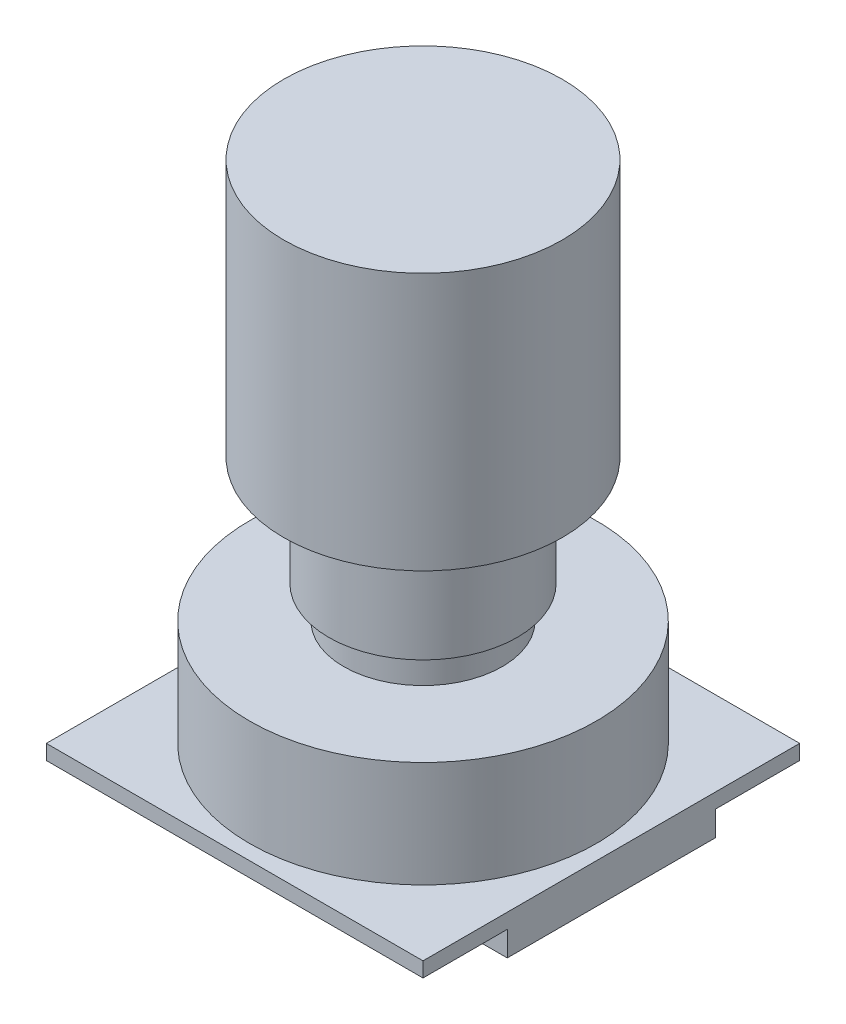
ISO-10303-21;
HEADER;
FILE_DESCRIPTION(('STEP AP214'),'2;1');
FILE_NAME('part.step','',(''),(''),'','','');
FILE_SCHEMA(('AUTOMOTIVE_DESIGN { 1 0 10303 214 1 1 1 1 }'));
ENDSEC;
DATA;
#1=APPLICATION_CONTEXT('core data for automotive mechanical design processes');
#2=APPLICATION_PROTOCOL_DEFINITION('international standard','automotive_design',2000,#1);
#3=PRODUCT_CONTEXT('',#1,'mechanical');
#4=PRODUCT('Part','Part','',(#3));
#5=PRODUCT_RELATED_PRODUCT_CATEGORY('part','',(#4));
#6=PRODUCT_DEFINITION_FORMATION('','',#4);
#7=PRODUCT_DEFINITION_CONTEXT('part definition',#1,'design');
#8=PRODUCT_DEFINITION('design','',#6,#7);
#9=PRODUCT_DEFINITION_SHAPE('','',#8);
#10=(LENGTH_UNIT() NAMED_UNIT(*) SI_UNIT(.MILLI.,.METRE.));
#11=(NAMED_UNIT(*) PLANE_ANGLE_UNIT() SI_UNIT($,.RADIAN.));
#12=(NAMED_UNIT(*) SI_UNIT($,.STERADIAN.) SOLID_ANGLE_UNIT());
#13=UNCERTAINTY_MEASURE_WITH_UNIT(LENGTH_MEASURE(1.E-05),#10,'distance_accuracy_value','');
#14=(GEOMETRIC_REPRESENTATION_CONTEXT(3) GLOBAL_UNCERTAINTY_ASSIGNED_CONTEXT((#13)) GLOBAL_UNIT_ASSIGNED_CONTEXT((#10,
#11,#12)) REPRESENTATION_CONTEXT('',''));
#15=CARTESIAN_POINT('',(0.,0.,0.));
#16=DIRECTION('',(0.,0.,1.));
#17=DIRECTION('',(1.,0.,0.));
#18=AXIS2_PLACEMENT_3D('',#15,#16,#17);
#19=CARTESIAN_POINT('',(19.,1.5,19.));
#20=DIRECTION('',(-1.,0.,0.));
#21=DIRECTION('',(0.,0.,1.));
#22=AXIS2_PLACEMENT_3D('',#19,#20,#21);
#23=PLANE('',#22);
#24=DIRECTION('',(0.,0.,-1.));
#25=VECTOR('',#24,1.);
#26=CARTESIAN_POINT('',(19.,0.,19.));
#27=LINE('',#26,#25);
#28=CARTESIAN_POINT('',(19.,0.,19.));
#29=VERTEX_POINT('',#28);
#30=CARTESIAN_POINT('',(19.,0.,10.5));
#31=VERTEX_POINT('',#30);
#32=EDGE_CURVE('E133',#29,#31,#27,.T.);
#33=ORIENTED_EDGE('',*,*,#32,.T.);
#34=DIRECTION('',(0.,1.,0.));
#35=VECTOR('',#34,1.);
#36=CARTESIAN_POINT('',(19.,-2.5,10.5));
#37=LINE('',#36,#35);
#38=CARTESIAN_POINT('',(19.,-2.5,10.5));
#39=VERTEX_POINT('',#38);
#40=EDGE_CURVE('E114',#39,#31,#37,.T.);
#41=ORIENTED_EDGE('',*,*,#40,.F.);
#42=DIRECTION('',(0.,0.,1.));
#43=VECTOR('',#42,1.);
#44=CARTESIAN_POINT('',(19.,-2.5,-10.5));
#45=LINE('',#44,#43);
#46=CARTESIAN_POINT('',(19.,-2.5,-10.5));
#47=VERTEX_POINT('',#46);
#48=EDGE_CURVE('E120',#47,#39,#45,.T.);
#49=ORIENTED_EDGE('',*,*,#48,.F.);
#50=DIRECTION('',(0.,1.,0.));
#51=VECTOR('',#50,1.);
#52=CARTESIAN_POINT('',(19.,-2.5,-10.5));
#53=LINE('',#52,#51);
#54=CARTESIAN_POINT('',(19.,0.,-10.5));
#55=VERTEX_POINT('',#54);
#56=EDGE_CURVE('E190',#47,#55,#53,.T.);
#57=ORIENTED_EDGE('',*,*,#56,.T.);
#58=CARTESIAN_POINT('',(19.,0.,-19.));
#59=VERTEX_POINT('',#58);
#60=EDGE_CURVE('E66',#55,#59,#27,.T.);
#61=ORIENTED_EDGE('',*,*,#60,.T.);
#62=DIRECTION('',(0.,-1.,0.));
#63=VECTOR('',#62,1.);
#64=CARTESIAN_POINT('',(19.,1.5,-19.));
#65=LINE('',#64,#63);
#66=CARTESIAN_POINT('',(19.,1.5,-19.));
#67=VERTEX_POINT('',#66);
#68=EDGE_CURVE('E48',#67,#59,#65,.T.);
#69=ORIENTED_EDGE('',*,*,#68,.F.);
#70=DIRECTION('',(0.,0.,-1.));
#71=VECTOR('',#70,1.);
#72=CARTESIAN_POINT('',(19.,1.5,19.));
#73=LINE('',#72,#71);
#74=CARTESIAN_POINT('',(19.,1.5,19.));
#75=VERTEX_POINT('',#74);
#76=EDGE_CURVE('E159',#75,#67,#73,.T.);
#77=ORIENTED_EDGE('',*,*,#76,.F.);
#78=DIRECTION('',(0.,-1.,0.));
#79=VECTOR('',#78,1.);
#80=CARTESIAN_POINT('',(19.,1.5,19.));
#81=LINE('',#80,#79);
#82=EDGE_CURVE('E169',#75,#29,#81,.T.);
#83=ORIENTED_EDGE('',*,*,#82,.T.);
#84=EDGE_LOOP('',(#33,#41,#49,#57,#61,#69,#77,#83));
#85=FACE_BOUND('',#84,.T.);
#86=ADVANCED_FACE('F45',(#85),#23,.F.);
#87=CARTESIAN_POINT('',(-19.,1.5,-19.));
#88=DIRECTION('',(0.,0.,1.));
#89=DIRECTION('',(1.,0.,0.));
#90=AXIS2_PLACEMENT_3D('',#87,#88,#89);
#91=PLANE('',#90);
#92=DIRECTION('',(-1.,0.,0.));
#93=VECTOR('',#92,1.);
#94=CARTESIAN_POINT('',(-19.,0.,-19.));
#95=LINE('',#94,#93);
#96=CARTESIAN_POINT('',(-19.,0.,-19.));
#97=VERTEX_POINT('',#96);
#98=EDGE_CURVE('E171',#59,#97,#95,.T.);
#99=ORIENTED_EDGE('',*,*,#98,.T.);
#100=DIRECTION('',(0.,-1.,0.));
#101=VECTOR('',#100,1.);
#102=CARTESIAN_POINT('',(-19.,1.5,-19.));
#103=LINE('',#102,#101);
#104=CARTESIAN_POINT('',(-19.,1.5,-19.));
#105=VERTEX_POINT('',#104);
#106=EDGE_CURVE('E179',#105,#97,#103,.T.);
#107=ORIENTED_EDGE('',*,*,#106,.F.);
#108=DIRECTION('',(-1.,0.,0.));
#109=VECTOR('',#108,1.);
#110=CARTESIAN_POINT('',(-19.,1.5,-19.));
#111=LINE('',#110,#109);
#112=EDGE_CURVE('E162',#67,#105,#111,.T.);
#113=ORIENTED_EDGE('',*,*,#112,.F.);
#114=ORIENTED_EDGE('',*,*,#68,.T.);
#115=EDGE_LOOP('',(#99,#107,#113,#114));
#116=FACE_BOUND('',#115,.T.);
#117=ADVANCED_FACE('F188',(#116),#91,.F.);
#118=CARTESIAN_POINT('',(-19.,1.5,19.));
#119=DIRECTION('',(1.,0.,0.));
#120=DIRECTION('',(0.,0.,-1.));
#121=AXIS2_PLACEMENT_3D('',#118,#119,#120);
#122=PLANE('',#121);
#123=DIRECTION('',(0.,0.,1.));
#124=VECTOR('',#123,1.);
#125=CARTESIAN_POINT('',(-19.,0.,19.));
#126=LINE('',#125,#124);
#127=CARTESIAN_POINT('',(-19.,0.,19.));
#128=VERTEX_POINT('',#127);
#129=EDGE_CURVE('E173',#97,#128,#126,.T.);
#130=ORIENTED_EDGE('',*,*,#129,.T.);
#131=DIRECTION('',(0.,-1.,0.));
#132=VECTOR('',#131,1.);
#133=CARTESIAN_POINT('',(-19.,1.5,19.));
#134=LINE('',#133,#132);
#135=CARTESIAN_POINT('',(-19.,1.5,19.));
#136=VERTEX_POINT('',#135);
#137=EDGE_CURVE('E177',#136,#128,#134,.T.);
#138=ORIENTED_EDGE('',*,*,#137,.F.);
#139=DIRECTION('',(0.,0.,1.));
#140=VECTOR('',#139,1.);
#141=CARTESIAN_POINT('',(-19.,1.5,19.));
#142=LINE('',#141,#140);
#143=EDGE_CURVE('E165',#105,#136,#142,.T.);
#144=ORIENTED_EDGE('',*,*,#143,.F.);
#145=ORIENTED_EDGE('',*,*,#106,.T.);
#146=EDGE_LOOP('',(#130,#138,#144,#145));
#147=FACE_BOUND('',#146,.T.);
#148=ADVANCED_FACE('F194',(#147),#122,.F.);
#149=CARTESIAN_POINT('',(-19.,1.5,19.));
#150=DIRECTION('',(0.,0.,-1.));
#151=DIRECTION('',(-1.,0.,0.));
#152=AXIS2_PLACEMENT_3D('',#149,#150,#151);
#153=PLANE('',#152);
#154=DIRECTION('',(1.,0.,0.));
#155=VECTOR('',#154,1.);
#156=CARTESIAN_POINT('',(-19.,0.,19.));
#157=LINE('',#156,#155);
#158=EDGE_CURVE('E163',#128,#29,#157,.T.);
#159=ORIENTED_EDGE('',*,*,#158,.T.);
#160=ORIENTED_EDGE('',*,*,#82,.F.);
#161=DIRECTION('',(1.,0.,0.));
#162=VECTOR('',#161,1.);
#163=CARTESIAN_POINT('',(-19.,1.5,19.));
#164=LINE('',#163,#162);
#165=EDGE_CURVE('E167',#136,#75,#164,.T.);
#166=ORIENTED_EDGE('',*,*,#165,.F.);
#167=ORIENTED_EDGE('',*,*,#137,.T.);
#168=EDGE_LOOP('',(#159,#160,#166,#167));
#169=FACE_BOUND('',#168,.T.);
#170=ADVANCED_FACE('F197',(#169),#153,.F.);
#171=CARTESIAN_POINT('',(0.,1.5,0.));
#172=DIRECTION('',(0.,-1.,0.));
#173=DIRECTION('',(0.,0.,-1.));
#174=AXIS2_PLACEMENT_3D('',#171,#172,#173);
#175=PLANE('',#174);
#176=CARTESIAN_POINT('',(0.,1.5,0.));
#177=DIRECTION('',(0.,1.,0.));
#178=DIRECTION('',(0.,0.,1.));
#179=AXIS2_PLACEMENT_3D('',#176,#177,#178);
#180=CIRCLE('',#179,17.5);
#181=CARTESIAN_POINT('',(0.,1.5,17.5));
#182=VERTEX_POINT('',#181);
#183=EDGE_CURVE('E53',#182,#182,#180,.T.);
#184=ORIENTED_EDGE('',*,*,#183,.F.);
#185=EDGE_LOOP('',(#184));
#186=FACE_BOUND('',#185,.T.);
#187=ORIENTED_EDGE('',*,*,#76,.T.);
#188=ORIENTED_EDGE('',*,*,#112,.T.);
#189=ORIENTED_EDGE('',*,*,#143,.T.);
#190=ORIENTED_EDGE('',*,*,#165,.T.);
#191=EDGE_LOOP('',(#187,#188,#189,#190));
#192=FACE_BOUND('',#191,.T.);
#193=ADVANCED_FACE('F200',(#186,#192),#175,.F.);
#194=CARTESIAN_POINT('',(0.,0.,0.));
#195=DIRECTION('',(0.,-1.,0.));
#196=DIRECTION('',(0.,0.,-1.));
#197=AXIS2_PLACEMENT_3D('',#194,#195,#196);
#198=PLANE('',#197);
#199=DIRECTION('',(1.,0.,0.));
#200=VECTOR('',#199,1.);
#201=CARTESIAN_POINT('',(19.,0.,-10.5));
#202=LINE('',#201,#200);
#203=CARTESIAN_POINT('',(13.,0.,-10.5));
#204=VERTEX_POINT('',#203);
#205=EDGE_CURVE('E61',#204,#55,#202,.T.);
#206=ORIENTED_EDGE('',*,*,#205,.F.);
#207=DIRECTION('',(0.,0.,-1.));
#208=VECTOR('',#207,1.);
#209=CARTESIAN_POINT('',(13.,0.,-10.5));
#210=LINE('',#209,#208);
#211=CARTESIAN_POINT('',(13.,0.,10.5));
#212=VERTEX_POINT('',#211);
#213=EDGE_CURVE('E364',#212,#204,#210,.T.);
#214=ORIENTED_EDGE('',*,*,#213,.F.);
#215=DIRECTION('',(-1.,0.,0.));
#216=VECTOR('',#215,1.);
#217=CARTESIAN_POINT('',(19.,0.,10.5));
#218=LINE('',#217,#216);
#219=EDGE_CURVE('E366',#31,#212,#218,.T.);
#220=ORIENTED_EDGE('',*,*,#219,.F.);
#221=ORIENTED_EDGE('',*,*,#32,.F.);
#222=ORIENTED_EDGE('',*,*,#158,.F.);
#223=ORIENTED_EDGE('',*,*,#129,.F.);
#224=ORIENTED_EDGE('',*,*,#98,.F.);
#225=ORIENTED_EDGE('',*,*,#60,.F.);
#226=EDGE_LOOP('',(#206,#214,#220,#221,#222,#223,#224,#225));
#227=FACE_BOUND('',#226,.T.);
#228=ADVANCED_FACE('F191',(#227),#198,.T.);
#229=CARTESIAN_POINT('',(0.,12.2,0.));
#230=DIRECTION('',(0.,-1.,0.));
#231=DIRECTION('',(0.,0.,-1.));
#232=AXIS2_PLACEMENT_3D('',#229,#230,#231);
#233=CYLINDRICAL_SURFACE('',#232,17.5);
#234=CARTESIAN_POINT('',(0.,12.2,0.));
#235=DIRECTION('',(0.,1.,0.));
#236=DIRECTION('',(0.,0.,1.));
#237=AXIS2_PLACEMENT_3D('',#234,#235,#236);
#238=CIRCLE('',#237,17.5);
#239=CARTESIAN_POINT('',(0.,12.2,17.5));
#240=VERTEX_POINT('',#239);
#241=EDGE_CURVE('E153',#240,#240,#238,.T.);
#242=ORIENTED_EDGE('',*,*,#241,.F.);
#243=EDGE_LOOP('',(#242));
#244=FACE_BOUND('',#243,.T.);
#245=ORIENTED_EDGE('',*,*,#183,.T.);
#246=EDGE_LOOP('',(#245));
#247=FACE_BOUND('',#246,.T.);
#248=ADVANCED_FACE('F209',(#244,#247),#233,.T.);
#249=CARTESIAN_POINT('',(0.,12.2,0.));
#250=DIRECTION('',(0.,1.,0.));
#251=DIRECTION('',(0.,0.,1.));
#252=AXIS2_PLACEMENT_3D('',#249,#250,#251);
#253=PLANE('',#252);
#254=CARTESIAN_POINT('',(0.,12.2,0.));
#255=DIRECTION('',(0.,1.,0.));
#256=DIRECTION('',(0.,0.,1.));
#257=AXIS2_PLACEMENT_3D('',#254,#255,#256);
#258=CIRCLE('',#257,8.);
#259=CARTESIAN_POINT('',(0.,12.2,8.));
#260=VERTEX_POINT('',#259);
#261=EDGE_CURVE('E11',#260,#260,#258,.T.);
#262=ORIENTED_EDGE('',*,*,#261,.F.);
#263=EDGE_LOOP('',(#262));
#264=FACE_BOUND('',#263,.T.);
#265=ORIENTED_EDGE('',*,*,#241,.T.);
#266=EDGE_LOOP('',(#265));
#267=FACE_BOUND('',#266,.T.);
#268=ADVANCED_FACE('F250',(#264,#267),#253,.T.);
#269=CARTESIAN_POINT('',(0.,15.5,0.));
#270=DIRECTION('',(0.,-1.,0.));
#271=DIRECTION('',(0.,0.,-1.));
#272=AXIS2_PLACEMENT_3D('',#269,#270,#271);
#273=CYLINDRICAL_SURFACE('',#272,8.);
#274=CARTESIAN_POINT('',(0.,15.5,0.));
#275=DIRECTION('',(0.,1.,0.));
#276=DIRECTION('',(0.,0.,1.));
#277=AXIS2_PLACEMENT_3D('',#274,#275,#276);
#278=CIRCLE('',#277,8.);
#279=CARTESIAN_POINT('',(0.,15.5,8.));
#280=VERTEX_POINT('',#279);
#281=EDGE_CURVE('E149',#280,#280,#278,.T.);
#282=ORIENTED_EDGE('',*,*,#281,.F.);
#283=EDGE_LOOP('',(#282));
#284=FACE_BOUND('',#283,.T.);
#285=ORIENTED_EDGE('',*,*,#261,.T.);
#286=EDGE_LOOP('',(#285));
#287=FACE_BOUND('',#286,.T.);
#288=ADVANCED_FACE('F259',(#284,#287),#273,.T.);
#289=CARTESIAN_POINT('',(0.,26.5,0.));
#290=DIRECTION('',(0.,-1.,0.));
#291=DIRECTION('',(0.,0.,-1.));
#292=AXIS2_PLACEMENT_3D('',#289,#290,#291);
#293=CYLINDRICAL_SURFACE('',#292,9.5);
#294=CARTESIAN_POINT('',(0.,26.5,0.));
#295=DIRECTION('',(0.,1.,0.));
#296=DIRECTION('',(0.,0.,1.));
#297=AXIS2_PLACEMENT_3D('',#294,#295,#296);
#298=CIRCLE('',#297,9.5);
#299=CARTESIAN_POINT('',(0.,26.5,9.5));
#300=VERTEX_POINT('',#299);
#301=EDGE_CURVE('E146',#300,#300,#298,.T.);
#302=ORIENTED_EDGE('',*,*,#301,.F.);
#303=EDGE_LOOP('',(#302));
#304=FACE_BOUND('',#303,.T.);
#305=CARTESIAN_POINT('',(0.,15.5,0.));
#306=DIRECTION('',(0.,1.,0.));
#307=DIRECTION('',(0.,0.,1.));
#308=AXIS2_PLACEMENT_3D('',#305,#306,#307);
#309=CIRCLE('',#308,9.5);
#310=CARTESIAN_POINT('',(0.,15.5,9.5));
#311=VERTEX_POINT('',#310);
#312=EDGE_CURVE('E144',#311,#311,#309,.T.);
#313=ORIENTED_EDGE('',*,*,#312,.T.);
#314=EDGE_LOOP('',(#313));
#315=FACE_BOUND('',#314,.T.);
#316=ADVANCED_FACE('F269',(#304,#315),#293,.T.);
#317=CARTESIAN_POINT('',(0.,15.5,0.));
#318=DIRECTION('',(0.,1.,0.));
#319=DIRECTION('',(0.,0.,1.));
#320=AXIS2_PLACEMENT_3D('',#317,#318,#319);
#321=PLANE('',#320);
#322=ORIENTED_EDGE('',*,*,#281,.T.);
#323=EDGE_LOOP('',(#322));
#324=FACE_BOUND('',#323,.T.);
#325=ORIENTED_EDGE('',*,*,#312,.F.);
#326=EDGE_LOOP('',(#325));
#327=FACE_BOUND('',#326,.T.);
#328=ADVANCED_FACE('F279',(#324,#327),#321,.F.);
#329=CARTESIAN_POINT('',(0.,52.5,0.));
#330=DIRECTION('',(0.,-1.,0.));
#331=DIRECTION('',(0.,0.,-1.));
#332=AXIS2_PLACEMENT_3D('',#329,#330,#331);
#333=CYLINDRICAL_SURFACE('',#332,14.05);
#334=CARTESIAN_POINT('',(0.,52.5,0.));
#335=DIRECTION('',(0.,1.,0.));
#336=DIRECTION('',(0.,0.,1.));
#337=AXIS2_PLACEMENT_3D('',#334,#335,#336);
#338=CIRCLE('',#337,14.05);
#339=CARTESIAN_POINT('',(0.,52.5,-14.05));
#340=VERTEX_POINT('',#339);
#341=EDGE_CURVE('E137',#340,#340,#338,.T.);
#342=CARTESIAN_POINT('',(0.,26.5,0.));
#343=DIRECTION('',(0.,1.,0.));
#344=DIRECTION('',(0.,0.,1.));
#345=AXIS2_PLACEMENT_3D('',#342,#343,#344);
#346=CIRCLE('',#345,14.05);
#347=CARTESIAN_POINT('',(0.,26.5,-14.05));
#348=VERTEX_POINT('',#347);
#349=EDGE_CURVE('E134',#348,#348,#346,.T.);
#350=CARTESIAN_POINT('',(0.,52.5,-14.05));
#351=CARTESIAN_POINT('',(0.,52.2291666666667,-14.05));
#352=CARTESIAN_POINT('',(0.,51.9583333333333,-14.05));
#353=CARTESIAN_POINT('',(0.,51.4166666666667,-14.05));
#354=CARTESIAN_POINT('',(0.,51.1458333333333,-14.05));
#355=CARTESIAN_POINT('',(0.,50.6041666666667,-14.05));
#356=CARTESIAN_POINT('',(0.,50.3333333333333,-14.05));
#357=CARTESIAN_POINT('',(0.,49.7916666666667,-14.05));
#358=CARTESIAN_POINT('',(0.,49.5208333333333,-14.05));
#359=CARTESIAN_POINT('',(0.,48.9791666666667,-14.05));
#360=CARTESIAN_POINT('',(0.,48.7083333333333,-14.05));
#361=CARTESIAN_POINT('',(0.,48.1666666666667,-14.05));
#362=CARTESIAN_POINT('',(0.,47.8958333333333,-14.05));
#363=CARTESIAN_POINT('',(0.,47.3541666666667,-14.05));
#364=CARTESIAN_POINT('',(0.,47.0833333333333,-14.05));
#365=CARTESIAN_POINT('',(0.,46.5416666666667,-14.05));
#366=CARTESIAN_POINT('',(0.,46.2708333333333,-14.05));
#367=CARTESIAN_POINT('',(0.,45.7291666666667,-14.05));
#368=CARTESIAN_POINT('',(0.,45.4583333333333,-14.05));
#369=CARTESIAN_POINT('',(0.,44.9166666666667,-14.05));
#370=CARTESIAN_POINT('',(0.,44.6458333333333,-14.05));
#371=CARTESIAN_POINT('',(0.,44.1041666666667,-14.05));
#372=CARTESIAN_POINT('',(0.,43.8333333333333,-14.05));
#373=CARTESIAN_POINT('',(0.,43.2916666666667,-14.05));
#374=CARTESIAN_POINT('',(0.,43.0208333333333,-14.05));
#375=CARTESIAN_POINT('',(0.,42.4791666666667,-14.05));
#376=CARTESIAN_POINT('',(0.,42.2083333333333,-14.05));
#377=CARTESIAN_POINT('',(0.,41.6666666666667,-14.05));
#378=CARTESIAN_POINT('',(0.,41.3958333333333,-14.05));
#379=CARTESIAN_POINT('',(0.,40.8541666666667,-14.05));
#380=CARTESIAN_POINT('',(0.,40.5833333333333,-14.05));
#381=CARTESIAN_POINT('',(0.,40.0416666666667,-14.05));
#382=CARTESIAN_POINT('',(0.,39.7708333333333,-14.05));
#383=CARTESIAN_POINT('',(0.,39.2291666666667,-14.05));
#384=CARTESIAN_POINT('',(0.,38.9583333333333,-14.05));
#385=CARTESIAN_POINT('',(0.,38.4166666666667,-14.05));
#386=CARTESIAN_POINT('',(0.,38.1458333333333,-14.05));
#387=CARTESIAN_POINT('',(0.,37.6041666666667,-14.05));
#388=CARTESIAN_POINT('',(0.,37.3333333333333,-14.05));
#389=CARTESIAN_POINT('',(0.,36.7916666666667,-14.05));
#390=CARTESIAN_POINT('',(0.,36.5208333333333,-14.05));
#391=CARTESIAN_POINT('',(0.,35.9791666666667,-14.05));
#392=CARTESIAN_POINT('',(0.,35.7083333333333,-14.05));
#393=CARTESIAN_POINT('',(0.,35.1666666666667,-14.05));
#394=CARTESIAN_POINT('',(0.,34.8958333333333,-14.05));
#395=CARTESIAN_POINT('',(0.,34.3541666666667,-14.05));
#396=CARTESIAN_POINT('',(0.,34.0833333333333,-14.05));
#397=CARTESIAN_POINT('',(0.,33.5416666666667,-14.05));
#398=CARTESIAN_POINT('',(0.,33.2708333333333,-14.05));
#399=CARTESIAN_POINT('',(0.,32.7291666666667,-14.05));
#400=CARTESIAN_POINT('',(0.,32.4583333333333,-14.05));
#401=CARTESIAN_POINT('',(0.,31.9166666666667,-14.05));
#402=CARTESIAN_POINT('',(0.,31.6458333333333,-14.05));
#403=CARTESIAN_POINT('',(0.,31.1041666666667,-14.05));
#404=CARTESIAN_POINT('',(0.,30.8333333333333,-14.05));
#405=CARTESIAN_POINT('',(0.,30.2916666666667,-14.05));
#406=CARTESIAN_POINT('',(0.,30.0208333333333,-14.05));
#407=CARTESIAN_POINT('',(0.,29.4791666666667,-14.05));
#408=CARTESIAN_POINT('',(0.,29.2083333333333,-14.05));
#409=CARTESIAN_POINT('',(0.,28.6666666666667,-14.05));
#410=CARTESIAN_POINT('',(0.,28.3958333333333,-14.05));
#411=CARTESIAN_POINT('',(0.,27.8541666666667,-14.05));
#412=CARTESIAN_POINT('',(0.,27.5833333333333,-14.05));
#413=CARTESIAN_POINT('',(0.,27.0416666666667,-14.05));
#414=CARTESIAN_POINT('',(0.,26.7708333333333,-14.05));
#415=CARTESIAN_POINT('',(0.,26.5,-14.05));
#416=B_SPLINE_CURVE_WITH_KNOTS('',3,(#350,#351,#352,#353,#354,#355,#356,#357,#358,#359,#360,
#361,#362,#363,#364,#365,#366,#367,#368,#369,#370,#371,#372,#373,#374,#375,#376,#377,#378,#379,
#380,#381,#382,#383,#384,#385,#386,#387,#388,#389,#390,#391,#392,#393,#394,#395,#396,#397,#398,
#399,#400,#401,#402,#403,#404,#405,#406,#407,#408,#409,#410,#411,#412,#413,#414,#415),
.UNSPECIFIED.,.F.,.F.,(4,2,2,2,2,2,2,2,2,2,2,2,2,2,2,2,2,2,2,2,2,2,2,2,2,2,2,2,2,2,2,2,4),(0.,
0.812499999999994,1.62499999999999,2.4375,3.25,4.0625,4.875,5.6875,6.49999999999999,
7.31249999999999,8.12499999999999,8.93749999999999,9.74999999999999,10.5625,11.375,12.1875,13.,
13.8125,14.625,15.4375,16.25,17.0625,17.875,18.6875,19.5,20.3125,21.125,21.9375,22.75,23.5625,
24.375,25.1875,26.),.UNSPECIFIED.);
#417=EDGE_CURVE('BSEAM289',#340,#348,#416,.T.);
#418=ORIENTED_EDGE('',*,*,#341,.F.);
#419=ORIENTED_EDGE('',*,*,#349,.T.);
#420=ORIENTED_EDGE('',*,*,#417,.T.);
#421=ORIENTED_EDGE('',*,*,#417,.F.);
#422=EDGE_LOOP('',(#418,#420,#419,#421));
#423=FACE_BOUND('',#422,.T.);
#424=ADVANCED_FACE('F289',(#423),#333,.T.);
#425=CARTESIAN_POINT('',(0.,52.5,0.));
#426=DIRECTION('',(0.,1.,0.));
#427=DIRECTION('',(0.,0.,1.));
#428=AXIS2_PLACEMENT_3D('',#425,#426,#427);
#429=PLANE('',#428);
#430=ORIENTED_EDGE('',*,*,#341,.T.);
#431=EDGE_LOOP('',(#430));
#432=FACE_BOUND('',#431,.T.);
#433=ADVANCED_FACE('F299',(#432),#429,.T.);
#434=CARTESIAN_POINT('',(0.,26.5,0.));
#435=DIRECTION('',(0.,1.,0.));
#436=DIRECTION('',(0.,0.,1.));
#437=AXIS2_PLACEMENT_3D('',#434,#435,#436);
#438=PLANE('',#437);
#439=ORIENTED_EDGE('',*,*,#301,.T.);
#440=EDGE_LOOP('',(#439));
#441=FACE_BOUND('',#440,.T.);
#442=ORIENTED_EDGE('',*,*,#349,.F.);
#443=EDGE_LOOP('',(#442));
#444=FACE_BOUND('',#443,.T.);
#445=ADVANCED_FACE('F309',(#441,#444),#438,.F.);
#446=CARTESIAN_POINT('',(19.,-2.5,10.5));
#447=DIRECTION('',(0.,0.,-1.));
#448=DIRECTION('',(-1.,0.,0.));
#449=AXIS2_PLACEMENT_3D('',#446,#447,#448);
#450=PLANE('',#449);
#451=ORIENTED_EDGE('',*,*,#219,.T.);
#452=DIRECTION('',(0.,1.,0.));
#453=VECTOR('',#452,1.);
#454=CARTESIAN_POINT('',(13.,-2.5,10.5));
#455=LINE('',#454,#453);
#456=CARTESIAN_POINT('',(13.,-2.5,10.5));
#457=VERTEX_POINT('',#456);
#458=EDGE_CURVE('E116',#457,#212,#455,.T.);
#459=ORIENTED_EDGE('',*,*,#458,.F.);
#460=DIRECTION('',(-1.,0.,0.));
#461=VECTOR('',#460,1.);
#462=CARTESIAN_POINT('',(19.,-2.5,10.5));
#463=LINE('',#462,#461);
#464=EDGE_CURVE('E109',#39,#457,#463,.T.);
#465=ORIENTED_EDGE('',*,*,#464,.F.);
#466=ORIENTED_EDGE('',*,*,#40,.T.);
#467=EDGE_LOOP('',(#451,#459,#465,#466));
#468=FACE_BOUND('',#467,.T.);
#469=ADVANCED_FACE('F112',(#468),#450,.F.);
#470=CARTESIAN_POINT('',(13.,-2.5,-10.5));
#471=DIRECTION('',(1.,0.,0.));
#472=DIRECTION('',(0.,0.,-1.));
#473=AXIS2_PLACEMENT_3D('',#470,#471,#472);
#474=PLANE('',#473);
#475=ORIENTED_EDGE('',*,*,#213,.T.);
#476=DIRECTION('',(0.,1.,0.));
#477=VECTOR('',#476,1.);
#478=CARTESIAN_POINT('',(13.,-2.5,-10.5));
#479=LINE('',#478,#477);
#480=CARTESIAN_POINT('',(13.,-2.5,-10.5));
#481=VERTEX_POINT('',#480);
#482=EDGE_CURVE('E139',#481,#204,#479,.T.);
#483=ORIENTED_EDGE('',*,*,#482,.F.);
#484=DIRECTION('',(0.,0.,-1.));
#485=VECTOR('',#484,1.);
#486=CARTESIAN_POINT('',(13.,-2.5,-10.5));
#487=LINE('',#486,#485);
#488=EDGE_CURVE('E119',#457,#481,#487,.T.);
#489=ORIENTED_EDGE('',*,*,#488,.F.);
#490=ORIENTED_EDGE('',*,*,#458,.T.);
#491=EDGE_LOOP('',(#475,#483,#489,#490));
#492=FACE_BOUND('',#491,.T.);
#493=ADVANCED_FACE('F332',(#492),#474,.F.);
#494=CARTESIAN_POINT('',(19.,-2.5,-10.5));
#495=DIRECTION('',(0.,0.,1.));
#496=DIRECTION('',(1.,0.,0.));
#497=AXIS2_PLACEMENT_3D('',#494,#495,#496);
#498=PLANE('',#497);
#499=ORIENTED_EDGE('',*,*,#205,.T.);
#500=ORIENTED_EDGE('',*,*,#56,.F.);
#501=DIRECTION('',(1.,0.,0.));
#502=VECTOR('',#501,1.);
#503=CARTESIAN_POINT('',(19.,-2.5,-10.5));
#504=LINE('',#503,#502);
#505=EDGE_CURVE('E125',#481,#47,#504,.T.);
#506=ORIENTED_EDGE('',*,*,#505,.F.);
#507=ORIENTED_EDGE('',*,*,#482,.T.);
#508=EDGE_LOOP('',(#499,#500,#506,#507));
#509=FACE_BOUND('',#508,.T.);
#510=ADVANCED_FACE('F341',(#509),#498,.F.);
#511=CARTESIAN_POINT('',(0.,-2.5,0.));
#512=DIRECTION('',(0.,-1.,0.));
#513=DIRECTION('',(0.,0.,-1.));
#514=AXIS2_PLACEMENT_3D('',#511,#512,#513);
#515=PLANE('',#514);
#516=ORIENTED_EDGE('',*,*,#48,.T.);
#517=ORIENTED_EDGE('',*,*,#464,.T.);
#518=ORIENTED_EDGE('',*,*,#488,.T.);
#519=ORIENTED_EDGE('',*,*,#505,.T.);
#520=EDGE_LOOP('',(#516,#517,#518,#519));
#521=FACE_BOUND('',#520,.T.);
#522=ADVANCED_FACE('F123',(#521),#515,.T.);
#523=CLOSED_SHELL('',(#86,#117,#148,#170,#193,#228,#248,#268,#288,#316,#328,#424,#433,#445,#469,
#493,#510,#522));
#524=MANIFOLD_SOLID_BREP('B2',#523);
#525=ADVANCED_BREP_SHAPE_REPRESENTATION('',(#18,#524),#14);
#526=SHAPE_DEFINITION_REPRESENTATION(#9,#525);
ENDSEC;
END-ISO-10303-21;
